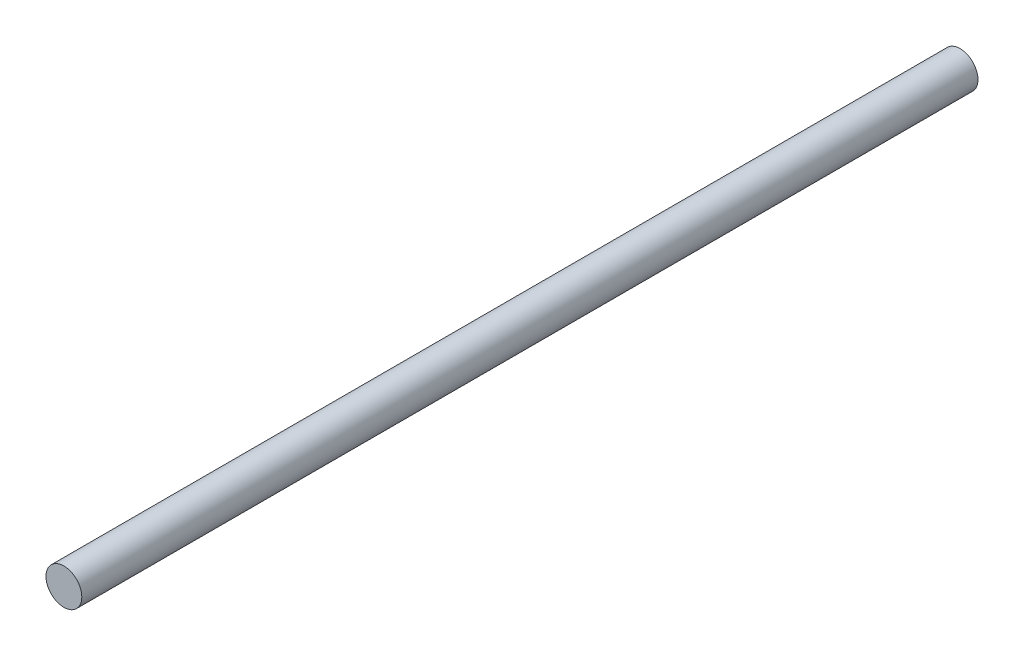
ISO-10303-21;
HEADER;
FILE_DESCRIPTION(('STEP AP214'),'2;1');
FILE_NAME('part.step','',(''),(''),'','','');
FILE_SCHEMA(('AUTOMOTIVE_DESIGN { 1 0 10303 214 1 1 1 1 }'));
ENDSEC;
DATA;
#1=APPLICATION_CONTEXT('core data for automotive mechanical design processes');
#2=APPLICATION_PROTOCOL_DEFINITION('international standard','automotive_design',2000,#1);
#3=PRODUCT_CONTEXT('',#1,'mechanical');
#4=PRODUCT('Part','Part','',(#3));
#5=PRODUCT_RELATED_PRODUCT_CATEGORY('part','',(#4));
#6=PRODUCT_DEFINITION_FORMATION('','',#4);
#7=PRODUCT_DEFINITION_CONTEXT('part definition',#1,'design');
#8=PRODUCT_DEFINITION('design','',#6,#7);
#9=PRODUCT_DEFINITION_SHAPE('','',#8);
#10=(LENGTH_UNIT() NAMED_UNIT(*) SI_UNIT(.MILLI.,.METRE.));
#11=(NAMED_UNIT(*) PLANE_ANGLE_UNIT() SI_UNIT($,.RADIAN.));
#12=(NAMED_UNIT(*) SI_UNIT($,.STERADIAN.) SOLID_ANGLE_UNIT());
#13=UNCERTAINTY_MEASURE_WITH_UNIT(LENGTH_MEASURE(1.E-05),#10,'distance_accuracy_value','');
#14=(GEOMETRIC_REPRESENTATION_CONTEXT(3) GLOBAL_UNCERTAINTY_ASSIGNED_CONTEXT((#13)) GLOBAL_UNIT_ASSIGNED_CONTEXT((#10,
#11,#12)) REPRESENTATION_CONTEXT('',''));
#15=CARTESIAN_POINT('',(0.,0.,0.));
#16=DIRECTION('',(0.,0.,1.));
#17=DIRECTION('',(1.,0.,0.));
#18=AXIS2_PLACEMENT_3D('',#15,#16,#17);
#19=CARTESIAN_POINT('',(-24.6494367800074,-15.5591415830546,125.));
#20=DIRECTION('',(0.,0.,-1.));
#21=DIRECTION('',(-1.,0.,0.));
#22=AXIS2_PLACEMENT_3D('',#19,#20,#21);
#23=CYLINDRICAL_SURFACE('',#22,2.);
#24=CARTESIAN_POINT('',(-24.6494367800074,-15.5591415830546,125.));
#25=DIRECTION('',(0.,0.,1.));
#26=DIRECTION('',(1.,0.,0.));
#27=AXIS2_PLACEMENT_3D('',#24,#25,#26);
#28=CIRCLE('',#27,2.);
#29=CARTESIAN_POINT('',(-22.6494367800074,-15.5591415830546,125.));
#30=VERTEX_POINT('',#29);
#31=EDGE_CURVE('E10',#30,#30,#28,.T.);
#32=ORIENTED_EDGE('',*,*,#31,.F.);
#33=EDGE_LOOP('',(#32));
#34=FACE_BOUND('',#33,.T.);
#35=CARTESIAN_POINT('',(-24.6494367800074,-15.5591415830546,25.));
#36=DIRECTION('',(0.,0.,1.));
#37=DIRECTION('',(1.,0.,0.));
#38=AXIS2_PLACEMENT_3D('',#35,#36,#37);
#39=CIRCLE('',#38,2.);
#40=CARTESIAN_POINT('',(-22.6494367800074,-15.5591415830546,25.));
#41=VERTEX_POINT('',#40);
#42=EDGE_CURVE('E32',#41,#41,#39,.T.);
#43=ORIENTED_EDGE('',*,*,#42,.T.);
#44=EDGE_LOOP('',(#43));
#45=FACE_BOUND('',#44,.T.);
#46=ADVANCED_FACE('F29',(#34,#45),#23,.T.);
#47=CARTESIAN_POINT('',(-24.6494367800074,-15.5591415830546,125.));
#48=DIRECTION('',(0.,0.,1.));
#49=DIRECTION('',(1.,0.,0.));
#50=AXIS2_PLACEMENT_3D('',#47,#48,#49);
#51=PLANE('',#50);
#52=ORIENTED_EDGE('',*,*,#31,.T.);
#53=EDGE_LOOP('',(#52));
#54=FACE_BOUND('',#53,.T.);
#55=ADVANCED_FACE('F44',(#54),#51,.T.);
#56=CARTESIAN_POINT('',(-24.6494367800074,-15.5591415830546,25.));
#57=DIRECTION('',(0.,0.,1.));
#58=DIRECTION('',(1.,0.,0.));
#59=AXIS2_PLACEMENT_3D('',#56,#57,#58);
#60=PLANE('',#59);
#61=ORIENTED_EDGE('',*,*,#42,.F.);
#62=EDGE_LOOP('',(#61));
#63=FACE_BOUND('',#62,.T.);
#64=ADVANCED_FACE('F42',(#63),#60,.F.);
#65=CLOSED_SHELL('',(#46,#55,#64));
#66=MANIFOLD_SOLID_BREP('B2',#65);
#67=ADVANCED_BREP_SHAPE_REPRESENTATION('',(#18,#66),#14);
#68=SHAPE_DEFINITION_REPRESENTATION(#9,#67);
ENDSEC;
END-ISO-10303-21;
